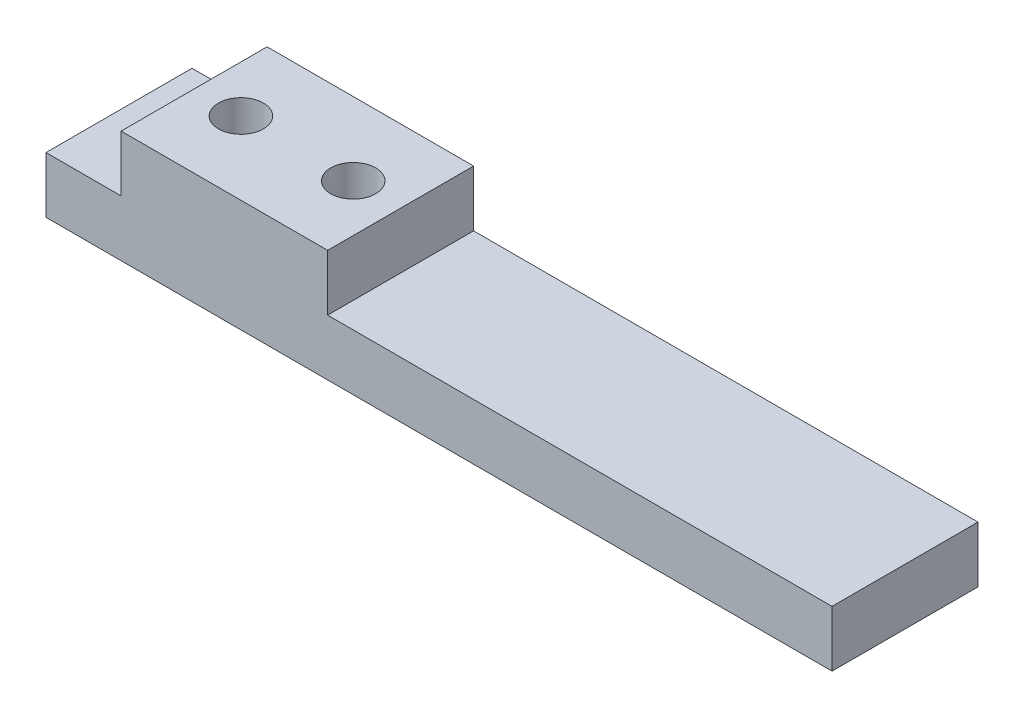
ISO-10303-21;
HEADER;
FILE_DESCRIPTION(('STEP AP214'),'2;1');
FILE_NAME('part.step','',(''),(''),'','','');
FILE_SCHEMA(('AUTOMOTIVE_DESIGN { 1 0 10303 214 1 1 1 1 }'));
ENDSEC;
DATA;
#1=APPLICATION_CONTEXT('core data for automotive mechanical design processes');
#2=APPLICATION_PROTOCOL_DEFINITION('international standard','automotive_design',2000,#1);
#3=PRODUCT_CONTEXT('',#1,'mechanical');
#4=PRODUCT('Part','Part','',(#3));
#5=PRODUCT_RELATED_PRODUCT_CATEGORY('part','',(#4));
#6=PRODUCT_DEFINITION_FORMATION('','',#4);
#7=PRODUCT_DEFINITION_CONTEXT('part definition',#1,'design');
#8=PRODUCT_DEFINITION('design','',#6,#7);
#9=PRODUCT_DEFINITION_SHAPE('','',#8);
#10=(LENGTH_UNIT() NAMED_UNIT(*) SI_UNIT(.MILLI.,.METRE.));
#11=(NAMED_UNIT(*) PLANE_ANGLE_UNIT() SI_UNIT($,.RADIAN.));
#12=(NAMED_UNIT(*) SI_UNIT($,.STERADIAN.) SOLID_ANGLE_UNIT());
#13=UNCERTAINTY_MEASURE_WITH_UNIT(LENGTH_MEASURE(1.E-05),#10,'distance_accuracy_value','');
#14=(GEOMETRIC_REPRESENTATION_CONTEXT(3) GLOBAL_UNCERTAINTY_ASSIGNED_CONTEXT((#13)) GLOBAL_UNIT_ASSIGNED_CONTEXT((#10,
#11,#12)) REPRESENTATION_CONTEXT('',''));
#15=CARTESIAN_POINT('',(0.,0.,0.));
#16=DIRECTION('',(0.,0.,1.));
#17=DIRECTION('',(1.,0.,0.));
#18=AXIS2_PLACEMENT_3D('',#15,#16,#17);
#19=CARTESIAN_POINT('',(0.,5.,0.));
#20=DIRECTION('',(0.,1.,0.));
#21=DIRECTION('',(0.,0.,1.));
#22=AXIS2_PLACEMENT_3D('',#19,#20,#21);
#23=PLANE('',#22);
#24=DIRECTION('',(0.,0.,1.));
#25=VECTOR('',#24,1.);
#26=CARTESIAN_POINT('',(-28.3095534894096,5.,-6.5));
#27=LINE('',#26,#25);
#28=CARTESIAN_POINT('',(-28.3095534894096,5.,-6.5));
#29=VERTEX_POINT('',#28);
#30=CARTESIAN_POINT('',(-28.3095534894096,5.,6.5));
#31=VERTEX_POINT('',#30);
#32=EDGE_CURVE('E125',#29,#31,#27,.T.);
#33=ORIENTED_EDGE('',*,*,#32,.F.);
#34=DIRECTION('',(-1.,0.,0.));
#35=VECTOR('',#34,1.);
#36=CARTESIAN_POINT('',(-35.,5.,-6.5));
#37=LINE('',#36,#35);
#38=CARTESIAN_POINT('',(-35.,5.,-6.5));
#39=VERTEX_POINT('',#38);
#40=EDGE_CURVE('E141',#29,#39,#37,.T.);
#41=ORIENTED_EDGE('',*,*,#40,.T.);
#42=DIRECTION('',(0.,0.,1.));
#43=VECTOR('',#42,1.);
#44=CARTESIAN_POINT('',(-35.,5.,-6.5));
#45=LINE('',#44,#43);
#46=CARTESIAN_POINT('',(-35.,5.,6.5));
#47=VERTEX_POINT('',#46);
#48=EDGE_CURVE('E145',#39,#47,#45,.T.);
#49=ORIENTED_EDGE('',*,*,#48,.T.);
#50=DIRECTION('',(1.,0.,0.));
#51=VECTOR('',#50,1.);
#52=CARTESIAN_POINT('',(-35.,5.,6.5));
#53=LINE('',#52,#51);
#54=EDGE_CURVE('E61',#47,#31,#53,.T.);
#55=ORIENTED_EDGE('',*,*,#54,.T.);
#56=EDGE_LOOP('',(#33,#41,#49,#55));
#57=FACE_BOUND('',#56,.T.);
#58=ADVANCED_FACE('F38',(#57),#23,.T.);
#59=CARTESIAN_POINT('',(35.,5.,-6.5));
#60=DIRECTION('',(-1.,0.,0.));
#61=DIRECTION('',(0.,0.,1.));
#62=AXIS2_PLACEMENT_3D('',#59,#60,#61);
#63=PLANE('',#62);
#64=DIRECTION('',(0.,0.,-1.));
#65=VECTOR('',#64,1.);
#66=CARTESIAN_POINT('',(35.,0.,-6.5));
#67=LINE('',#66,#65);
#68=CARTESIAN_POINT('',(35.,0.,6.5));
#69=VERTEX_POINT('',#68);
#70=CARTESIAN_POINT('',(35.,0.,-6.5));
#71=VERTEX_POINT('',#70);
#72=EDGE_CURVE('E136',#69,#71,#67,.T.);
#73=ORIENTED_EDGE('',*,*,#72,.T.);
#74=DIRECTION('',(0.,-1.,0.));
#75=VECTOR('',#74,1.);
#76=CARTESIAN_POINT('',(35.,5.,-6.5));
#77=LINE('',#76,#75);
#78=CARTESIAN_POINT('',(35.,5.,-6.5));
#79=VERTEX_POINT('',#78);
#80=EDGE_CURVE('E11',#79,#71,#77,.T.);
#81=ORIENTED_EDGE('',*,*,#80,.F.);
#82=DIRECTION('',(0.,0.,-1.));
#83=VECTOR('',#82,1.);
#84=CARTESIAN_POINT('',(35.,5.,-6.5));
#85=LINE('',#84,#83);
#86=CARTESIAN_POINT('',(35.,5.,6.5));
#87=VERTEX_POINT('',#86);
#88=EDGE_CURVE('E138',#87,#79,#85,.T.);
#89=ORIENTED_EDGE('',*,*,#88,.F.);
#90=DIRECTION('',(0.,-1.,0.));
#91=VECTOR('',#90,1.);
#92=CARTESIAN_POINT('',(35.,5.,6.5));
#93=LINE('',#92,#91);
#94=EDGE_CURVE('E149',#87,#69,#93,.T.);
#95=ORIENTED_EDGE('',*,*,#94,.T.);
#96=EDGE_LOOP('',(#73,#81,#89,#95));
#97=FACE_BOUND('',#96,.T.);
#98=ADVANCED_FACE('F40',(#97),#63,.F.);
#99=CARTESIAN_POINT('',(-35.,5.,-6.5));
#100=DIRECTION('',(0.,0.,1.));
#101=DIRECTION('',(1.,0.,0.));
#102=AXIS2_PLACEMENT_3D('',#99,#100,#101);
#103=PLANE('',#102);
#104=DIRECTION('',(-1.,0.,0.));
#105=VECTOR('',#104,1.);
#106=CARTESIAN_POINT('',(-35.,0.,-6.5));
#107=LINE('',#106,#105);
#108=CARTESIAN_POINT('',(-35.,0.,-6.5));
#109=VERTEX_POINT('',#108);
#110=EDGE_CURVE('E152',#71,#109,#107,.T.);
#111=ORIENTED_EDGE('',*,*,#110,.T.);
#112=DIRECTION('',(0.,-1.,0.));
#113=VECTOR('',#112,1.);
#114=CARTESIAN_POINT('',(-35.,5.,-6.5));
#115=LINE('',#114,#113);
#116=EDGE_CURVE('E46',#39,#109,#115,.T.);
#117=ORIENTED_EDGE('',*,*,#116,.F.);
#118=ORIENTED_EDGE('',*,*,#40,.F.);
#119=DIRECTION('',(0.,-1.,0.));
#120=VECTOR('',#119,1.);
#121=CARTESIAN_POINT('',(-28.3095534894096,10.,-6.5));
#122=LINE('',#121,#120);
#123=CARTESIAN_POINT('',(-28.3095534894096,10.,-6.5));
#124=VERTEX_POINT('',#123);
#125=EDGE_CURVE('E184',#124,#29,#122,.T.);
#126=ORIENTED_EDGE('',*,*,#125,.F.);
#127=DIRECTION('',(-1.,0.,0.));
#128=VECTOR('',#127,1.);
#129=CARTESIAN_POINT('',(-28.3095534894096,10.,-6.5));
#130=LINE('',#129,#128);
#131=CARTESIAN_POINT('',(-9.91920416380848,10.,-6.5));
#132=VERTEX_POINT('',#131);
#133=EDGE_CURVE('E119',#132,#124,#130,.T.);
#134=ORIENTED_EDGE('',*,*,#133,.F.);
#135=DIRECTION('',(0.,-1.,0.));
#136=VECTOR('',#135,1.);
#137=CARTESIAN_POINT('',(-9.91920416380848,10.,-6.5));
#138=LINE('',#137,#136);
#139=CARTESIAN_POINT('',(-9.91920416380848,5.,-6.5));
#140=VERTEX_POINT('',#139);
#141=EDGE_CURVE('E131',#132,#140,#138,.T.);
#142=ORIENTED_EDGE('',*,*,#141,.T.);
#143=EDGE_CURVE('E143',#79,#140,#37,.T.);
#144=ORIENTED_EDGE('',*,*,#143,.F.);
#145=ORIENTED_EDGE('',*,*,#80,.T.);
#146=EDGE_LOOP('',(#111,#117,#118,#126,#134,#142,#144,#145));
#147=FACE_BOUND('',#146,.T.);
#148=ADVANCED_FACE('F190',(#147),#103,.F.);
#149=CARTESIAN_POINT('',(-35.,5.,-6.5));
#150=DIRECTION('',(1.,0.,0.));
#151=DIRECTION('',(0.,0.,-1.));
#152=AXIS2_PLACEMENT_3D('',#149,#150,#151);
#153=PLANE('',#152);
#154=DIRECTION('',(0.,0.,1.));
#155=VECTOR('',#154,1.);
#156=CARTESIAN_POINT('',(-35.,0.,-6.5));
#157=LINE('',#156,#155);
#158=CARTESIAN_POINT('',(-35.,0.,6.5));
#159=VERTEX_POINT('',#158);
#160=EDGE_CURVE('E154',#109,#159,#157,.T.);
#161=ORIENTED_EDGE('',*,*,#160,.T.);
#162=DIRECTION('',(0.,-1.,0.));
#163=VECTOR('',#162,1.);
#164=CARTESIAN_POINT('',(-35.,5.,6.5));
#165=LINE('',#164,#163);
#166=EDGE_CURVE('E159',#47,#159,#165,.T.);
#167=ORIENTED_EDGE('',*,*,#166,.F.);
#168=ORIENTED_EDGE('',*,*,#48,.F.);
#169=ORIENTED_EDGE('',*,*,#116,.T.);
#170=EDGE_LOOP('',(#161,#167,#168,#169));
#171=FACE_BOUND('',#170,.T.);
#172=ADVANCED_FACE('F166',(#171),#153,.F.);
#173=CARTESIAN_POINT('',(-35.,5.,6.5));
#174=DIRECTION('',(0.,0.,-1.));
#175=DIRECTION('',(-1.,0.,0.));
#176=AXIS2_PLACEMENT_3D('',#173,#174,#175);
#177=PLANE('',#176);
#178=DIRECTION('',(1.,0.,0.));
#179=VECTOR('',#178,1.);
#180=CARTESIAN_POINT('',(-35.,0.,6.5));
#181=LINE('',#180,#179);
#182=EDGE_CURVE('E142',#159,#69,#181,.T.);
#183=ORIENTED_EDGE('',*,*,#182,.T.);
#184=ORIENTED_EDGE('',*,*,#94,.F.);
#185=CARTESIAN_POINT('',(-9.91920416380848,5.,6.5));
#186=VERTEX_POINT('',#185);
#187=EDGE_CURVE('E147',#186,#87,#53,.T.);
#188=ORIENTED_EDGE('',*,*,#187,.F.);
#189=DIRECTION('',(0.,-1.,0.));
#190=VECTOR('',#189,1.);
#191=CARTESIAN_POINT('',(-9.91920416380848,10.,6.5));
#192=LINE('',#191,#190);
#193=CARTESIAN_POINT('',(-9.91920416380848,10.,6.5));
#194=VERTEX_POINT('',#193);
#195=EDGE_CURVE('E109',#194,#186,#192,.T.);
#196=ORIENTED_EDGE('',*,*,#195,.F.);
#197=DIRECTION('',(1.,0.,0.));
#198=VECTOR('',#197,1.);
#199=CARTESIAN_POINT('',(-28.3095534894096,10.,6.5));
#200=LINE('',#199,#198);
#201=CARTESIAN_POINT('',(-28.3095534894096,10.,6.5));
#202=VERTEX_POINT('',#201);
#203=EDGE_CURVE('E102',#202,#194,#200,.T.);
#204=ORIENTED_EDGE('',*,*,#203,.F.);
#205=DIRECTION('',(0.,-1.,0.));
#206=VECTOR('',#205,1.);
#207=CARTESIAN_POINT('',(-28.3095534894096,10.,6.5));
#208=LINE('',#207,#206);
#209=EDGE_CURVE('E106',#202,#31,#208,.T.);
#210=ORIENTED_EDGE('',*,*,#209,.T.);
#211=ORIENTED_EDGE('',*,*,#54,.F.);
#212=ORIENTED_EDGE('',*,*,#166,.T.);
#213=EDGE_LOOP('',(#183,#184,#188,#196,#204,#210,#211,#212));
#214=FACE_BOUND('',#213,.T.);
#215=ADVANCED_FACE('F104',(#214),#177,.F.);
#216=DIRECTION('',(0.,0.,-1.));
#217=VECTOR('',#216,1.);
#218=CARTESIAN_POINT('',(-9.91920416380848,5.,-6.5));
#219=LINE('',#218,#217);
#220=EDGE_CURVE('E53',#186,#140,#219,.T.);
#221=ORIENTED_EDGE('',*,*,#220,.F.);
#222=ORIENTED_EDGE('',*,*,#187,.T.);
#223=ORIENTED_EDGE('',*,*,#88,.T.);
#224=ORIENTED_EDGE('',*,*,#143,.T.);
#225=EDGE_LOOP('',(#221,#222,#223,#224));
#226=FACE_BOUND('',#225,.T.);
#227=ADVANCED_FACE('F178',(#226),#23,.T.);
#228=CARTESIAN_POINT('',(0.,0.,0.));
#229=DIRECTION('',(0.,1.,0.));
#230=DIRECTION('',(0.,0.,1.));
#231=AXIS2_PLACEMENT_3D('',#228,#229,#230);
#232=PLANE('',#231);
#233=CARTESIAN_POINT('',(-24.141309666895,0.,0.));
#234=DIRECTION('',(0.,1.,0.));
#235=DIRECTION('',(0.,0.,1.));
#236=AXIS2_PLACEMENT_3D('',#233,#234,#235);
#237=CIRCLE('',#236,2.);
#238=CARTESIAN_POINT('',(-24.141309666895,0.,2.));
#239=VERTEX_POINT('',#238);
#240=EDGE_CURVE('E129',#239,#239,#237,.T.);
#241=ORIENTED_EDGE('',*,*,#240,.T.);
#242=EDGE_LOOP('',(#241));
#243=FACE_BOUND('',#242,.T.);
#244=CARTESIAN_POINT('',(-14.141309666895,0.,0.));
#245=DIRECTION('',(0.,1.,0.));
#246=DIRECTION('',(0.,0.,1.));
#247=AXIS2_PLACEMENT_3D('',#244,#245,#246);
#248=CIRCLE('',#247,2.);
#249=CARTESIAN_POINT('',(-14.141309666895,0.,2.));
#250=VERTEX_POINT('',#249);
#251=EDGE_CURVE('E126',#250,#250,#248,.T.);
#252=ORIENTED_EDGE('',*,*,#251,.T.);
#253=EDGE_LOOP('',(#252));
#254=FACE_BOUND('',#253,.T.);
#255=ORIENTED_EDGE('',*,*,#72,.F.);
#256=ORIENTED_EDGE('',*,*,#182,.F.);
#257=ORIENTED_EDGE('',*,*,#160,.F.);
#258=ORIENTED_EDGE('',*,*,#110,.F.);
#259=EDGE_LOOP('',(#255,#256,#257,#258));
#260=FACE_BOUND('',#259,.T.);
#261=ADVANCED_FACE('F173',(#243,#254,#260),#232,.F.);
#262=CARTESIAN_POINT('',(-14.141309666895,0.,0.));
#263=DIRECTION('',(0.,1.,0.));
#264=DIRECTION('',(0.,0.,1.));
#265=AXIS2_PLACEMENT_3D('',#262,#263,#264);
#266=CYLINDRICAL_SURFACE('',#265,2.);
#267=ORIENTED_EDGE('',*,*,#251,.F.);
#268=EDGE_LOOP('',(#267));
#269=FACE_BOUND('',#268,.T.);
#270=CARTESIAN_POINT('',(-14.141309666895,10.,0.));
#271=DIRECTION('',(0.,1.,0.));
#272=DIRECTION('',(0.,0.,1.));
#273=AXIS2_PLACEMENT_3D('',#270,#271,#272);
#274=CIRCLE('',#273,2.);
#275=CARTESIAN_POINT('',(-14.141309666895,10.,2.));
#276=VERTEX_POINT('',#275);
#277=EDGE_CURVE('E353',#276,#276,#274,.T.);
#278=ORIENTED_EDGE('',*,*,#277,.T.);
#279=EDGE_LOOP('',(#278));
#280=FACE_BOUND('',#279,.T.);
#281=ADVANCED_FACE('F203',(#269,#280),#266,.F.);
#282=CARTESIAN_POINT('',(-24.141309666895,0.,0.));
#283=DIRECTION('',(0.,1.,0.));
#284=DIRECTION('',(0.,0.,1.));
#285=AXIS2_PLACEMENT_3D('',#282,#283,#284);
#286=CYLINDRICAL_SURFACE('',#285,2.);
#287=ORIENTED_EDGE('',*,*,#240,.F.);
#288=EDGE_LOOP('',(#287));
#289=FACE_BOUND('',#288,.T.);
#290=CARTESIAN_POINT('',(-24.141309666895,10.,0.));
#291=DIRECTION('',(0.,1.,0.));
#292=DIRECTION('',(0.,0.,1.));
#293=AXIS2_PLACEMENT_3D('',#290,#291,#292);
#294=CIRCLE('',#293,2.);
#295=CARTESIAN_POINT('',(-24.141309666895,10.,2.));
#296=VERTEX_POINT('',#295);
#297=EDGE_CURVE('E188',#296,#296,#294,.T.);
#298=ORIENTED_EDGE('',*,*,#297,.T.);
#299=EDGE_LOOP('',(#298));
#300=FACE_BOUND('',#299,.T.);
#301=ADVANCED_FACE('F244',(#289,#300),#286,.F.);
#302=CARTESIAN_POINT('',(0.,10.,0.));
#303=DIRECTION('',(0.,1.,0.));
#304=DIRECTION('',(0.,0.,1.));
#305=AXIS2_PLACEMENT_3D('',#302,#303,#304);
#306=PLANE('',#305);
#307=ORIENTED_EDGE('',*,*,#297,.F.);
#308=EDGE_LOOP('',(#307));
#309=FACE_BOUND('',#308,.T.);
#310=DIRECTION('',(0.,0.,1.));
#311=VECTOR('',#310,1.);
#312=CARTESIAN_POINT('',(-28.3095534894096,10.,-6.5));
#313=LINE('',#312,#311);
#314=EDGE_CURVE('E113',#124,#202,#313,.T.);
#315=ORIENTED_EDGE('',*,*,#314,.T.);
#316=ORIENTED_EDGE('',*,*,#203,.T.);
#317=DIRECTION('',(0.,0.,-1.));
#318=VECTOR('',#317,1.);
#319=CARTESIAN_POINT('',(-9.91920416380848,10.,-6.5));
#320=LINE('',#319,#318);
#321=EDGE_CURVE('E112',#194,#132,#320,.T.);
#322=ORIENTED_EDGE('',*,*,#321,.T.);
#323=ORIENTED_EDGE('',*,*,#133,.T.);
#324=EDGE_LOOP('',(#315,#316,#322,#323));
#325=FACE_BOUND('',#324,.T.);
#326=ORIENTED_EDGE('',*,*,#277,.F.);
#327=EDGE_LOOP('',(#326));
#328=FACE_BOUND('',#327,.T.);
#329=ADVANCED_FACE('F116',(#309,#325,#328),#306,.T.);
#330=CARTESIAN_POINT('',(-28.3095534894096,10.,-6.5));
#331=DIRECTION('',(1.,0.,0.));
#332=DIRECTION('',(0.,0.,-1.));
#333=AXIS2_PLACEMENT_3D('',#330,#331,#332);
#334=PLANE('',#333);
#335=ORIENTED_EDGE('',*,*,#32,.T.);
#336=ORIENTED_EDGE('',*,*,#209,.F.);
#337=ORIENTED_EDGE('',*,*,#314,.F.);
#338=ORIENTED_EDGE('',*,*,#125,.T.);
#339=EDGE_LOOP('',(#335,#336,#337,#338));
#340=FACE_BOUND('',#339,.T.);
#341=ADVANCED_FACE('F124',(#340),#334,.F.);
#342=CARTESIAN_POINT('',(-9.91920416380848,10.,-6.5));
#343=DIRECTION('',(-1.,0.,0.));
#344=DIRECTION('',(0.,0.,1.));
#345=AXIS2_PLACEMENT_3D('',#342,#343,#344);
#346=PLANE('',#345);
#347=ORIENTED_EDGE('',*,*,#220,.T.);
#348=ORIENTED_EDGE('',*,*,#141,.F.);
#349=ORIENTED_EDGE('',*,*,#321,.F.);
#350=ORIENTED_EDGE('',*,*,#195,.T.);
#351=EDGE_LOOP('',(#347,#348,#349,#350));
#352=FACE_BOUND('',#351,.T.);
#353=ADVANCED_FACE('F180',(#352),#346,.F.);
#354=CLOSED_SHELL('',(#58,#98,#148,#172,#215,#227,#261,#281,#301,#329,#341,#353));
#355=MANIFOLD_SOLID_BREP('B2',#354);
#356=ADVANCED_BREP_SHAPE_REPRESENTATION('',(#18,#355),#14);
#357=SHAPE_DEFINITION_REPRESENTATION(#9,#356);
ENDSEC;
END-ISO-10303-21;
